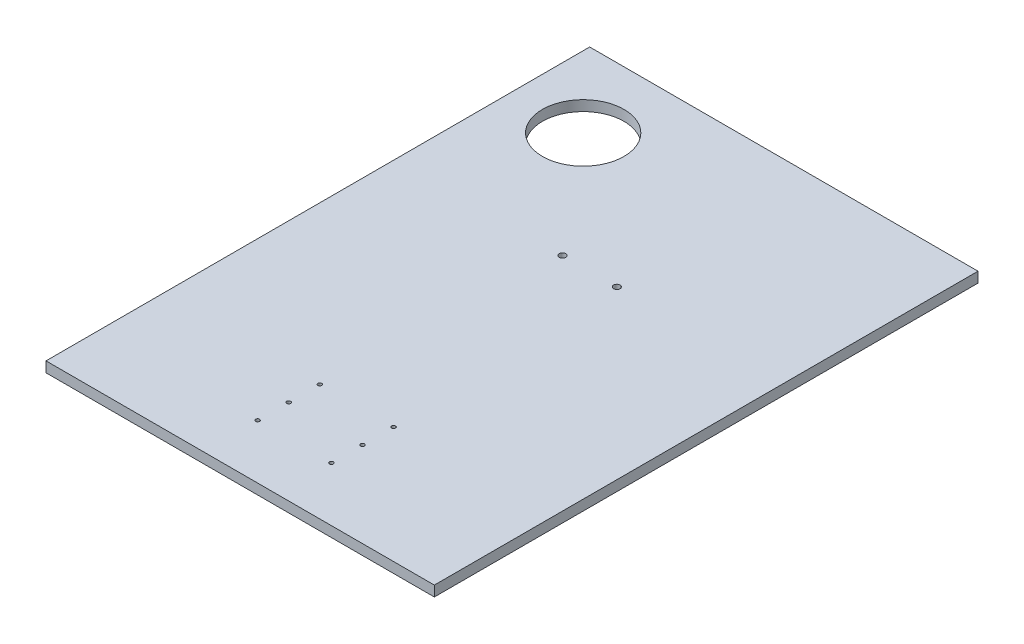
ISO-10303-21;
HEADER;
FILE_DESCRIPTION(('STEP AP214'),'2;1');
FILE_NAME('part.step','',(''),(''),'','','');
FILE_SCHEMA(('AUTOMOTIVE_DESIGN { 1 0 10303 214 1 1 1 1 }'));
ENDSEC;
DATA;
#1=APPLICATION_CONTEXT('core data for automotive mechanical design processes');
#2=APPLICATION_PROTOCOL_DEFINITION('international standard','automotive_design',2000,#1);
#3=PRODUCT_CONTEXT('',#1,'mechanical');
#4=PRODUCT('Part','Part','',(#3));
#5=PRODUCT_RELATED_PRODUCT_CATEGORY('part','',(#4));
#6=PRODUCT_DEFINITION_FORMATION('','',#4);
#7=PRODUCT_DEFINITION_CONTEXT('part definition',#1,'design');
#8=PRODUCT_DEFINITION('design','',#6,#7);
#9=PRODUCT_DEFINITION_SHAPE('','',#8);
#10=(LENGTH_UNIT() NAMED_UNIT(*) SI_UNIT(.MILLI.,.METRE.));
#11=(NAMED_UNIT(*) PLANE_ANGLE_UNIT() SI_UNIT($,.RADIAN.));
#12=(NAMED_UNIT(*) SI_UNIT($,.STERADIAN.) SOLID_ANGLE_UNIT());
#13=UNCERTAINTY_MEASURE_WITH_UNIT(LENGTH_MEASURE(1.E-05),#10,'distance_accuracy_value','');
#14=(GEOMETRIC_REPRESENTATION_CONTEXT(3) GLOBAL_UNCERTAINTY_ASSIGNED_CONTEXT((#13)) GLOBAL_UNIT_ASSIGNED_CONTEXT((#10,
#11,#12)) REPRESENTATION_CONTEXT('',''));
#15=CARTESIAN_POINT('',(0.,0.,0.));
#16=DIRECTION('',(0.,0.,1.));
#17=DIRECTION('',(1.,0.,0.));
#18=AXIS2_PLACEMENT_3D('',#15,#16,#17);
#19=CARTESIAN_POINT('',(0.,8.,0.));
#20=DIRECTION('',(0.,-1.,0.));
#21=DIRECTION('',(0.,0.,-1.));
#22=AXIS2_PLACEMENT_3D('',#19,#20,#21);
#23=PLANE('',#22);
#24=DIRECTION('',(0.,0.,-1.));
#25=VECTOR('',#24,1.);
#26=CARTESIAN_POINT('',(150.,8.,210.));
#27=LINE('',#26,#25);
#28=CARTESIAN_POINT('',(150.,8.,210.));
#29=VERTEX_POINT('',#28);
#30=CARTESIAN_POINT('',(150.,8.,-210.));
#31=VERTEX_POINT('',#30);
#32=EDGE_CURVE('E89',#29,#31,#27,.T.);
#33=ORIENTED_EDGE('',*,*,#32,.T.);
#34=DIRECTION('',(-1.,0.,0.));
#35=VECTOR('',#34,1.);
#36=CARTESIAN_POINT('',(-150.,8.,-210.));
#37=LINE('',#36,#35);
#38=CARTESIAN_POINT('',(-150.,8.,-210.));
#39=VERTEX_POINT('',#38);
#40=EDGE_CURVE('E84',#31,#39,#37,.T.);
#41=ORIENTED_EDGE('',*,*,#40,.T.);
#42=DIRECTION('',(0.,0.,1.));
#43=VECTOR('',#42,1.);
#44=CARTESIAN_POINT('',(-150.,8.,210.));
#45=LINE('',#44,#43);
#46=CARTESIAN_POINT('',(-150.,8.,210.));
#47=VERTEX_POINT('',#46);
#48=EDGE_CURVE('E87',#39,#47,#45,.T.);
#49=ORIENTED_EDGE('',*,*,#48,.T.);
#50=DIRECTION('',(1.,0.,0.));
#51=VECTOR('',#50,1.);
#52=CARTESIAN_POINT('',(-150.,8.,210.));
#53=LINE('',#52,#51);
#54=EDGE_CURVE('E54',#47,#29,#53,.T.);
#55=ORIENTED_EDGE('',*,*,#54,.T.);
#56=EDGE_LOOP('',(#33,#41,#49,#55));
#57=FACE_BOUND('',#56,.T.);
#58=CARTESIAN_POINT('',(-28.5,8.,120.));
#59=DIRECTION('',(0.,1.,0.));
#60=DIRECTION('',(0.,0.,1.));
#61=AXIS2_PLACEMENT_3D('',#58,#59,#60);
#62=CIRCLE('',#61,1.5);
#63=CARTESIAN_POINT('',(-28.5,8.,121.5));
#64=VERTEX_POINT('',#63);
#65=EDGE_CURVE('E104',#64,#64,#62,.T.);
#66=ORIENTED_EDGE('',*,*,#65,.F.);
#67=EDGE_LOOP('',(#66));
#68=FACE_BOUND('',#67,.T.);
#69=CARTESIAN_POINT('',(-28.5,8.,144.));
#70=DIRECTION('',(0.,1.,0.));
#71=DIRECTION('',(0.,0.,1.));
#72=AXIS2_PLACEMENT_3D('',#69,#70,#71);
#73=CIRCLE('',#72,1.5);
#74=CARTESIAN_POINT('',(-28.5,8.,145.5));
#75=VERTEX_POINT('',#74);
#76=EDGE_CURVE('E119',#75,#75,#73,.T.);
#77=ORIENTED_EDGE('',*,*,#76,.F.);
#78=EDGE_LOOP('',(#77));
#79=FACE_BOUND('',#78,.T.);
#80=CARTESIAN_POINT('',(-28.5,8.,168.));
#81=DIRECTION('',(0.,1.,0.));
#82=DIRECTION('',(0.,0.,1.));
#83=AXIS2_PLACEMENT_3D('',#80,#81,#82);
#84=CIRCLE('',#83,1.5);
#85=CARTESIAN_POINT('',(-28.5,8.,169.5));
#86=VERTEX_POINT('',#85);
#87=EDGE_CURVE('E125',#86,#86,#84,.T.);
#88=ORIENTED_EDGE('',*,*,#87,.F.);
#89=EDGE_LOOP('',(#88));
#90=FACE_BOUND('',#89,.T.);
#91=CARTESIAN_POINT('',(28.5,8.,168.));
#92=DIRECTION('',(0.,1.,0.));
#93=DIRECTION('',(0.,0.,-1.));
#94=AXIS2_PLACEMENT_3D('',#91,#92,#93);
#95=CIRCLE('',#94,1.5);
#96=CARTESIAN_POINT('',(28.5,8.,166.5));
#97=VERTEX_POINT('',#96);
#98=EDGE_CURVE('E131',#97,#97,#95,.T.);
#99=ORIENTED_EDGE('',*,*,#98,.F.);
#100=EDGE_LOOP('',(#99));
#101=FACE_BOUND('',#100,.T.);
#102=CARTESIAN_POINT('',(28.5,8.,144.));
#103=DIRECTION('',(0.,1.,0.));
#104=DIRECTION('',(0.,0.,-1.));
#105=AXIS2_PLACEMENT_3D('',#102,#103,#104);
#106=CIRCLE('',#105,1.5);
#107=CARTESIAN_POINT('',(28.5,8.,142.5));
#108=VERTEX_POINT('',#107);
#109=EDGE_CURVE('E137',#108,#108,#106,.T.);
#110=ORIENTED_EDGE('',*,*,#109,.F.);
#111=EDGE_LOOP('',(#110));
#112=FACE_BOUND('',#111,.T.);
#113=CARTESIAN_POINT('',(28.5,8.,120.));
#114=DIRECTION('',(0.,1.,0.));
#115=DIRECTION('',(0.,0.,-1.));
#116=AXIS2_PLACEMENT_3D('',#113,#114,#115);
#117=CIRCLE('',#116,1.5);
#118=CARTESIAN_POINT('',(28.5,8.,118.5));
#119=VERTEX_POINT('',#118);
#120=EDGE_CURVE('E143',#119,#119,#117,.T.);
#121=ORIENTED_EDGE('',*,*,#120,.F.);
#122=EDGE_LOOP('',(#121));
#123=FACE_BOUND('',#122,.T.);
#124=CARTESIAN_POINT('',(-95.0000000000001,8.,-150.));
#125=DIRECTION('',(0.,1.,0.));
#126=DIRECTION('',(0.,0.,1.));
#127=AXIS2_PLACEMENT_3D('',#124,#125,#126);
#128=CIRCLE('',#127,31.5);
#129=CARTESIAN_POINT('',(-95.0000000000001,8.,-118.5));
#130=VERTEX_POINT('',#129);
#131=EDGE_CURVE('E149',#130,#130,#128,.T.);
#132=ORIENTED_EDGE('',*,*,#131,.F.);
#133=EDGE_LOOP('',(#132));
#134=FACE_BOUND('',#133,.T.);
#135=CARTESIAN_POINT('',(-21.,8.,-59.9999999999999));
#136=DIRECTION('',(0.,1.,0.));
#137=DIRECTION('',(0.,0.,1.));
#138=AXIS2_PLACEMENT_3D('',#135,#136,#137);
#139=CIRCLE('',#138,2.5);
#140=CARTESIAN_POINT('',(-21.,8.,-57.4999999999999));
#141=VERTEX_POINT('',#140);
#142=EDGE_CURVE('E155',#141,#141,#139,.T.);
#143=ORIENTED_EDGE('',*,*,#142,.F.);
#144=EDGE_LOOP('',(#143));
#145=FACE_BOUND('',#144,.T.);
#146=CARTESIAN_POINT('',(21.,8.,-60.));
#147=DIRECTION('',(0.,1.,0.));
#148=DIRECTION('',(0.,0.,-1.));
#149=AXIS2_PLACEMENT_3D('',#146,#147,#148);
#150=CIRCLE('',#149,2.5);
#151=CARTESIAN_POINT('',(21.,8.,-62.5));
#152=VERTEX_POINT('',#151);
#153=EDGE_CURVE('E161',#152,#152,#150,.T.);
#154=ORIENTED_EDGE('',*,*,#153,.F.);
#155=EDGE_LOOP('',(#154));
#156=FACE_BOUND('',#155,.T.);
#157=ADVANCED_FACE('F37',(#57,#68,#79,#90,#101,#112,#123,#134,#145,#156),#23,.F.);
#158=CARTESIAN_POINT('',(0.,0.,0.));
#159=DIRECTION('',(0.,-1.,0.));
#160=DIRECTION('',(0.,0.,-1.));
#161=AXIS2_PLACEMENT_3D('',#158,#159,#160);
#162=PLANE('',#161);
#163=CARTESIAN_POINT('',(-21.,0.,-59.9999999999999));
#164=DIRECTION('',(0.,1.,0.));
#165=DIRECTION('',(0.,0.,1.));
#166=AXIS2_PLACEMENT_3D('',#163,#164,#165);
#167=CIRCLE('',#166,2.5);
#168=CARTESIAN_POINT('',(-21.,0.,-57.4999999999999));
#169=VERTEX_POINT('',#168);
#170=EDGE_CURVE('E158',#169,#169,#167,.T.);
#171=ORIENTED_EDGE('',*,*,#170,.T.);
#172=EDGE_LOOP('',(#171));
#173=FACE_BOUND('',#172,.T.);
#174=CARTESIAN_POINT('',(28.5,0.,120.));
#175=DIRECTION('',(0.,1.,0.));
#176=DIRECTION('',(0.,0.,-1.));
#177=AXIS2_PLACEMENT_3D('',#174,#175,#176);
#178=CIRCLE('',#177,1.5);
#179=CARTESIAN_POINT('',(28.5,0.,118.5));
#180=VERTEX_POINT('',#179);
#181=EDGE_CURVE('E146',#180,#180,#178,.T.);
#182=ORIENTED_EDGE('',*,*,#181,.T.);
#183=EDGE_LOOP('',(#182));
#184=FACE_BOUND('',#183,.T.);
#185=CARTESIAN_POINT('',(28.5,0.,168.));
#186=DIRECTION('',(0.,1.,0.));
#187=DIRECTION('',(0.,0.,-1.));
#188=AXIS2_PLACEMENT_3D('',#185,#186,#187);
#189=CIRCLE('',#188,1.5);
#190=CARTESIAN_POINT('',(28.5,0.,166.5));
#191=VERTEX_POINT('',#190);
#192=EDGE_CURVE('E134',#191,#191,#189,.T.);
#193=ORIENTED_EDGE('',*,*,#192,.T.);
#194=EDGE_LOOP('',(#193));
#195=FACE_BOUND('',#194,.T.);
#196=CARTESIAN_POINT('',(-28.5,0.,144.));
#197=DIRECTION('',(0.,1.,0.));
#198=DIRECTION('',(0.,0.,1.));
#199=AXIS2_PLACEMENT_3D('',#196,#197,#198);
#200=CIRCLE('',#199,1.5);
#201=CARTESIAN_POINT('',(-28.5,0.,145.5));
#202=VERTEX_POINT('',#201);
#203=EDGE_CURVE('E122',#202,#202,#200,.T.);
#204=ORIENTED_EDGE('',*,*,#203,.T.);
#205=EDGE_LOOP('',(#204));
#206=FACE_BOUND('',#205,.T.);
#207=DIRECTION('',(0.,0.,-1.));
#208=VECTOR('',#207,1.);
#209=CARTESIAN_POINT('',(150.,0.,210.));
#210=LINE('',#209,#208);
#211=CARTESIAN_POINT('',(150.,0.,210.));
#212=VERTEX_POINT('',#211);
#213=CARTESIAN_POINT('',(150.,0.,-210.));
#214=VERTEX_POINT('',#213);
#215=EDGE_CURVE('E101',#212,#214,#210,.T.);
#216=ORIENTED_EDGE('',*,*,#215,.F.);
#217=DIRECTION('',(1.,0.,0.));
#218=VECTOR('',#217,1.);
#219=CARTESIAN_POINT('',(-150.,0.,210.));
#220=LINE('',#219,#218);
#221=CARTESIAN_POINT('',(-150.,0.,210.));
#222=VERTEX_POINT('',#221);
#223=EDGE_CURVE('E77',#222,#212,#220,.T.);
#224=ORIENTED_EDGE('',*,*,#223,.F.);
#225=DIRECTION('',(0.,0.,1.));
#226=VECTOR('',#225,1.);
#227=CARTESIAN_POINT('',(-150.,0.,210.));
#228=LINE('',#227,#226);
#229=CARTESIAN_POINT('',(-150.,0.,-210.));
#230=VERTEX_POINT('',#229);
#231=EDGE_CURVE('E71',#230,#222,#228,.T.);
#232=ORIENTED_EDGE('',*,*,#231,.F.);
#233=DIRECTION('',(-1.,0.,0.));
#234=VECTOR('',#233,1.);
#235=CARTESIAN_POINT('',(-150.,0.,-210.));
#236=LINE('',#235,#234);
#237=EDGE_CURVE('E93',#214,#230,#236,.T.);
#238=ORIENTED_EDGE('',*,*,#237,.F.);
#239=EDGE_LOOP('',(#216,#224,#232,#238));
#240=FACE_BOUND('',#239,.T.);
#241=CARTESIAN_POINT('',(-28.5,0.,120.));
#242=DIRECTION('',(0.,1.,0.));
#243=DIRECTION('',(0.,0.,1.));
#244=AXIS2_PLACEMENT_3D('',#241,#242,#243);
#245=CIRCLE('',#244,1.5);
#246=CARTESIAN_POINT('',(-28.5,0.,121.5));
#247=VERTEX_POINT('',#246);
#248=EDGE_CURVE('E116',#247,#247,#245,.T.);
#249=ORIENTED_EDGE('',*,*,#248,.T.);
#250=EDGE_LOOP('',(#249));
#251=FACE_BOUND('',#250,.T.);
#252=CARTESIAN_POINT('',(-28.5,0.,168.));
#253=DIRECTION('',(0.,1.,0.));
#254=DIRECTION('',(0.,0.,1.));
#255=AXIS2_PLACEMENT_3D('',#252,#253,#254);
#256=CIRCLE('',#255,1.5);
#257=CARTESIAN_POINT('',(-28.5,0.,169.5));
#258=VERTEX_POINT('',#257);
#259=EDGE_CURVE('E128',#258,#258,#256,.T.);
#260=ORIENTED_EDGE('',*,*,#259,.T.);
#261=EDGE_LOOP('',(#260));
#262=FACE_BOUND('',#261,.T.);
#263=CARTESIAN_POINT('',(28.5,0.,144.));
#264=DIRECTION('',(0.,1.,0.));
#265=DIRECTION('',(0.,0.,-1.));
#266=AXIS2_PLACEMENT_3D('',#263,#264,#265);
#267=CIRCLE('',#266,1.5);
#268=CARTESIAN_POINT('',(28.5,0.,142.5));
#269=VERTEX_POINT('',#268);
#270=EDGE_CURVE('E140',#269,#269,#267,.T.);
#271=ORIENTED_EDGE('',*,*,#270,.T.);
#272=EDGE_LOOP('',(#271));
#273=FACE_BOUND('',#272,.T.);
#274=CARTESIAN_POINT('',(-95.0000000000001,0.,-150.));
#275=DIRECTION('',(0.,1.,0.));
#276=DIRECTION('',(0.,0.,1.));
#277=AXIS2_PLACEMENT_3D('',#274,#275,#276);
#278=CIRCLE('',#277,31.5);
#279=CARTESIAN_POINT('',(-95.0000000000001,0.,-118.5));
#280=VERTEX_POINT('',#279);
#281=EDGE_CURVE('E152',#280,#280,#278,.T.);
#282=ORIENTED_EDGE('',*,*,#281,.T.);
#283=EDGE_LOOP('',(#282));
#284=FACE_BOUND('',#283,.T.);
#285=CARTESIAN_POINT('',(21.,0.,-60.));
#286=DIRECTION('',(0.,1.,0.));
#287=DIRECTION('',(0.,0.,-1.));
#288=AXIS2_PLACEMENT_3D('',#285,#286,#287);
#289=CIRCLE('',#288,2.5);
#290=CARTESIAN_POINT('',(21.,0.,-62.5));
#291=VERTEX_POINT('',#290);
#292=EDGE_CURVE('E164',#291,#291,#289,.T.);
#293=ORIENTED_EDGE('',*,*,#292,.T.);
#294=EDGE_LOOP('',(#293));
#295=FACE_BOUND('',#294,.T.);
#296=ADVANCED_FACE('F112',(#173,#184,#195,#206,#240,#251,#262,#273,#284,#295),#162,.T.);
#297=CARTESIAN_POINT('',(150.,8.,210.));
#298=DIRECTION('',(-1.,0.,0.));
#299=DIRECTION('',(0.,0.,1.));
#300=AXIS2_PLACEMENT_3D('',#297,#298,#299);
#301=PLANE('',#300);
#302=ORIENTED_EDGE('',*,*,#215,.T.);
#303=DIRECTION('',(0.,-1.,0.));
#304=VECTOR('',#303,1.);
#305=CARTESIAN_POINT('',(150.,8.,-210.));
#306=LINE('',#305,#304);
#307=EDGE_CURVE('E11',#31,#214,#306,.T.);
#308=ORIENTED_EDGE('',*,*,#307,.F.);
#309=ORIENTED_EDGE('',*,*,#32,.F.);
#310=DIRECTION('',(0.,-1.,0.));
#311=VECTOR('',#310,1.);
#312=CARTESIAN_POINT('',(150.,8.,210.));
#313=LINE('',#312,#311);
#314=EDGE_CURVE('E97',#29,#212,#313,.T.);
#315=ORIENTED_EDGE('',*,*,#314,.T.);
#316=EDGE_LOOP('',(#302,#308,#309,#315));
#317=FACE_BOUND('',#316,.T.);
#318=ADVANCED_FACE('F39',(#317),#301,.F.);
#319=CARTESIAN_POINT('',(-150.,8.,-210.));
#320=DIRECTION('',(0.,0.,1.));
#321=DIRECTION('',(1.,0.,0.));
#322=AXIS2_PLACEMENT_3D('',#319,#320,#321);
#323=PLANE('',#322);
#324=ORIENTED_EDGE('',*,*,#237,.T.);
#325=DIRECTION('',(0.,-1.,0.));
#326=VECTOR('',#325,1.);
#327=CARTESIAN_POINT('',(-150.,8.,-210.));
#328=LINE('',#327,#326);
#329=EDGE_CURVE('E46',#39,#230,#328,.T.);
#330=ORIENTED_EDGE('',*,*,#329,.F.);
#331=ORIENTED_EDGE('',*,*,#40,.F.);
#332=ORIENTED_EDGE('',*,*,#307,.T.);
#333=EDGE_LOOP('',(#324,#330,#331,#332));
#334=FACE_BOUND('',#333,.T.);
#335=ADVANCED_FACE('F92',(#334),#323,.F.);
#336=CARTESIAN_POINT('',(-150.,8.,210.));
#337=DIRECTION('',(1.,0.,0.));
#338=DIRECTION('',(0.,0.,-1.));
#339=AXIS2_PLACEMENT_3D('',#336,#337,#338);
#340=PLANE('',#339);
#341=ORIENTED_EDGE('',*,*,#231,.T.);
#342=DIRECTION('',(0.,-1.,0.));
#343=VECTOR('',#342,1.);
#344=CARTESIAN_POINT('',(-150.,8.,210.));
#345=LINE('',#344,#343);
#346=EDGE_CURVE('E94',#47,#222,#345,.T.);
#347=ORIENTED_EDGE('',*,*,#346,.F.);
#348=ORIENTED_EDGE('',*,*,#48,.F.);
#349=ORIENTED_EDGE('',*,*,#329,.T.);
#350=EDGE_LOOP('',(#341,#347,#348,#349));
#351=FACE_BOUND('',#350,.T.);
#352=ADVANCED_FACE('F95',(#351),#340,.F.);
#353=CARTESIAN_POINT('',(-150.,8.,210.));
#354=DIRECTION('',(0.,0.,-1.));
#355=DIRECTION('',(-1.,0.,0.));
#356=AXIS2_PLACEMENT_3D('',#353,#354,#355);
#357=PLANE('',#356);
#358=ORIENTED_EDGE('',*,*,#223,.T.);
#359=ORIENTED_EDGE('',*,*,#314,.F.);
#360=ORIENTED_EDGE('',*,*,#54,.F.);
#361=ORIENTED_EDGE('',*,*,#346,.T.);
#362=EDGE_LOOP('',(#358,#359,#360,#361));
#363=FACE_BOUND('',#362,.T.);
#364=ADVANCED_FACE('F109',(#363),#357,.F.);
#365=CARTESIAN_POINT('',(-28.5,8.,120.));
#366=DIRECTION('',(0.,-1.,0.));
#367=DIRECTION('',(0.,0.,-1.));
#368=AXIS2_PLACEMENT_3D('',#365,#366,#367);
#369=CYLINDRICAL_SURFACE('',#368,1.5);
#370=ORIENTED_EDGE('',*,*,#65,.T.);
#371=EDGE_LOOP('',(#370));
#372=FACE_BOUND('',#371,.T.);
#373=ORIENTED_EDGE('',*,*,#248,.F.);
#374=EDGE_LOOP('',(#373));
#375=FACE_BOUND('',#374,.T.);
#376=ADVANCED_FACE('F181',(#372,#375),#369,.F.);
#377=CARTESIAN_POINT('',(-28.5,8.,144.));
#378=DIRECTION('',(0.,-1.,0.));
#379=DIRECTION('',(0.,0.,-1.));
#380=AXIS2_PLACEMENT_3D('',#377,#378,#379);
#381=CYLINDRICAL_SURFACE('',#380,1.5);
#382=ORIENTED_EDGE('',*,*,#76,.T.);
#383=EDGE_LOOP('',(#382));
#384=FACE_BOUND('',#383,.T.);
#385=ORIENTED_EDGE('',*,*,#203,.F.);
#386=EDGE_LOOP('',(#385));
#387=FACE_BOUND('',#386,.T.);
#388=ADVANCED_FACE('F235',(#384,#387),#381,.F.);
#389=CARTESIAN_POINT('',(-28.5,8.,168.));
#390=DIRECTION('',(0.,-1.,0.));
#391=DIRECTION('',(0.,0.,-1.));
#392=AXIS2_PLACEMENT_3D('',#389,#390,#391);
#393=CYLINDRICAL_SURFACE('',#392,1.5);
#394=ORIENTED_EDGE('',*,*,#87,.T.);
#395=EDGE_LOOP('',(#394));
#396=FACE_BOUND('',#395,.T.);
#397=ORIENTED_EDGE('',*,*,#259,.F.);
#398=EDGE_LOOP('',(#397));
#399=FACE_BOUND('',#398,.T.);
#400=ADVANCED_FACE('F244',(#396,#399),#393,.F.);
#401=CARTESIAN_POINT('',(28.5,8.,168.));
#402=DIRECTION('',(0.,-1.,0.));
#403=DIRECTION('',(0.,0.,-1.));
#404=AXIS2_PLACEMENT_3D('',#401,#402,#403);
#405=CYLINDRICAL_SURFACE('',#404,1.5);
#406=ORIENTED_EDGE('',*,*,#98,.T.);
#407=EDGE_LOOP('',(#406));
#408=FACE_BOUND('',#407,.T.);
#409=ORIENTED_EDGE('',*,*,#192,.F.);
#410=EDGE_LOOP('',(#409));
#411=FACE_BOUND('',#410,.T.);
#412=ADVANCED_FACE('F253',(#408,#411),#405,.F.);
#413=CARTESIAN_POINT('',(28.5,8.,144.));
#414=DIRECTION('',(0.,-1.,0.));
#415=DIRECTION('',(0.,0.,-1.));
#416=AXIS2_PLACEMENT_3D('',#413,#414,#415);
#417=CYLINDRICAL_SURFACE('',#416,1.5);
#418=ORIENTED_EDGE('',*,*,#109,.T.);
#419=EDGE_LOOP('',(#418));
#420=FACE_BOUND('',#419,.T.);
#421=ORIENTED_EDGE('',*,*,#270,.F.);
#422=EDGE_LOOP('',(#421));
#423=FACE_BOUND('',#422,.T.);
#424=ADVANCED_FACE('F263',(#420,#423),#417,.F.);
#425=CARTESIAN_POINT('',(28.5,8.,120.));
#426=DIRECTION('',(0.,-1.,0.));
#427=DIRECTION('',(0.,0.,-1.));
#428=AXIS2_PLACEMENT_3D('',#425,#426,#427);
#429=CYLINDRICAL_SURFACE('',#428,1.5);
#430=ORIENTED_EDGE('',*,*,#120,.T.);
#431=EDGE_LOOP('',(#430));
#432=FACE_BOUND('',#431,.T.);
#433=ORIENTED_EDGE('',*,*,#181,.F.);
#434=EDGE_LOOP('',(#433));
#435=FACE_BOUND('',#434,.T.);
#436=ADVANCED_FACE('F273',(#432,#435),#429,.F.);
#437=CARTESIAN_POINT('',(-95.0000000000001,8.,-150.));
#438=DIRECTION('',(0.,-1.,0.));
#439=DIRECTION('',(0.,0.,-1.));
#440=AXIS2_PLACEMENT_3D('',#437,#438,#439);
#441=CYLINDRICAL_SURFACE('',#440,31.5);
#442=ORIENTED_EDGE('',*,*,#131,.T.);
#443=EDGE_LOOP('',(#442));
#444=FACE_BOUND('',#443,.T.);
#445=ORIENTED_EDGE('',*,*,#281,.F.);
#446=EDGE_LOOP('',(#445));
#447=FACE_BOUND('',#446,.T.);
#448=ADVANCED_FACE('F283',(#444,#447),#441,.F.);
#449=CARTESIAN_POINT('',(-21.,8.,-59.9999999999999));
#450=DIRECTION('',(0.,-1.,0.));
#451=DIRECTION('',(0.,0.,-1.));
#452=AXIS2_PLACEMENT_3D('',#449,#450,#451);
#453=CYLINDRICAL_SURFACE('',#452,2.5);
#454=ORIENTED_EDGE('',*,*,#142,.T.);
#455=EDGE_LOOP('',(#454));
#456=FACE_BOUND('',#455,.T.);
#457=ORIENTED_EDGE('',*,*,#170,.F.);
#458=EDGE_LOOP('',(#457));
#459=FACE_BOUND('',#458,.T.);
#460=ADVANCED_FACE('F293',(#456,#459),#453,.F.);
#461=CARTESIAN_POINT('',(21.,8.,-60.));
#462=DIRECTION('',(0.,-1.,0.));
#463=DIRECTION('',(0.,0.,-1.));
#464=AXIS2_PLACEMENT_3D('',#461,#462,#463);
#465=CYLINDRICAL_SURFACE('',#464,2.5);
#466=ORIENTED_EDGE('',*,*,#153,.T.);
#467=EDGE_LOOP('',(#466));
#468=FACE_BOUND('',#467,.T.);
#469=ORIENTED_EDGE('',*,*,#292,.F.);
#470=EDGE_LOOP('',(#469));
#471=FACE_BOUND('',#470,.T.);
#472=ADVANCED_FACE('F170',(#468,#471),#465,.F.);
#473=CLOSED_SHELL('',(#157,#296,#318,#335,#352,#364,#376,#388,#400,#412,#424,#436,#448,#460,#472));
#474=MANIFOLD_SOLID_BREP('B2',#473);
#475=ADVANCED_BREP_SHAPE_REPRESENTATION('',(#18,#474),#14);
#476=SHAPE_DEFINITION_REPRESENTATION(#9,#475);
ENDSEC;
END-ISO-10303-21;
